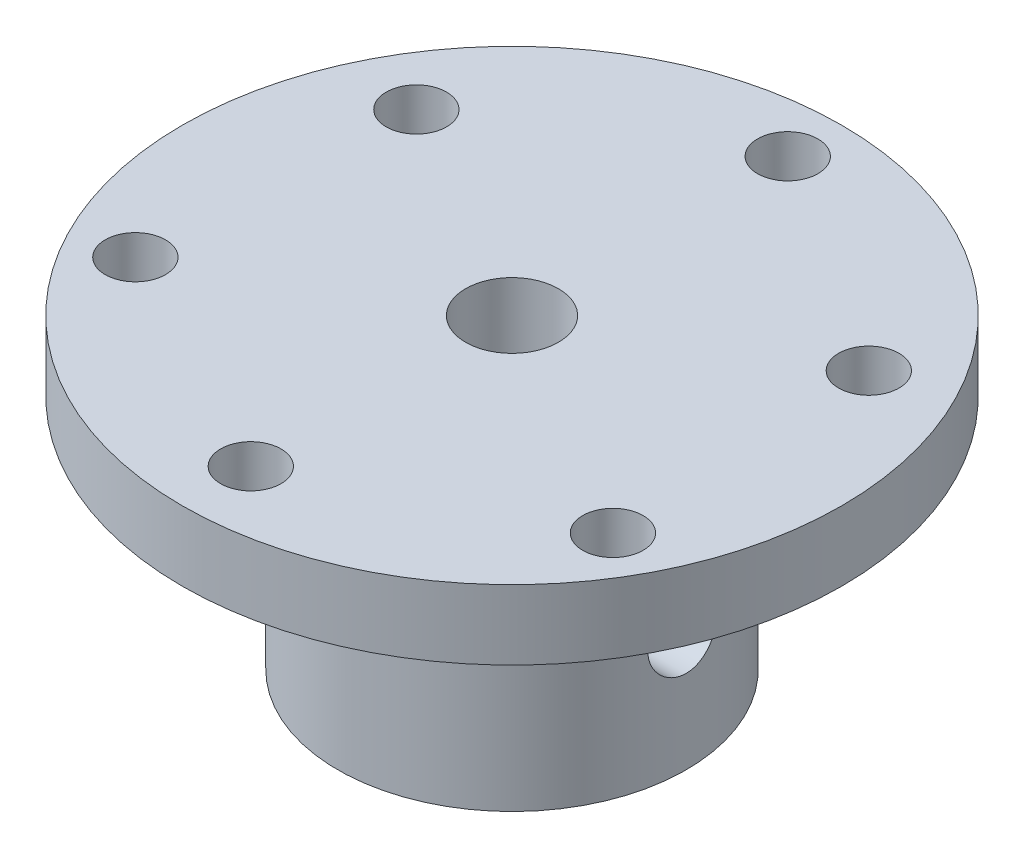
ISO-10303-21;
HEADER;
FILE_DESCRIPTION(('STEP AP214'),'2;1');
FILE_NAME('part.step','',(''),(''),'','','');
FILE_SCHEMA(('AUTOMOTIVE_DESIGN { 1 0 10303 214 1 1 1 1 }'));
ENDSEC;
DATA;
#1=APPLICATION_CONTEXT('core data for automotive mechanical design processes');
#2=APPLICATION_PROTOCOL_DEFINITION('international standard','automotive_design',2000,#1);
#3=PRODUCT_CONTEXT('',#1,'mechanical');
#4=PRODUCT('Part','Part','',(#3));
#5=PRODUCT_RELATED_PRODUCT_CATEGORY('part','',(#4));
#6=PRODUCT_DEFINITION_FORMATION('','',#4);
#7=PRODUCT_DEFINITION_CONTEXT('part definition',#1,'design');
#8=PRODUCT_DEFINITION('design','',#6,#7);
#9=PRODUCT_DEFINITION_SHAPE('','',#8);
#10=(LENGTH_UNIT() NAMED_UNIT(*) SI_UNIT(.MILLI.,.METRE.));
#11=(NAMED_UNIT(*) PLANE_ANGLE_UNIT() SI_UNIT($,.RADIAN.));
#12=(NAMED_UNIT(*) SI_UNIT($,.STERADIAN.) SOLID_ANGLE_UNIT());
#13=UNCERTAINTY_MEASURE_WITH_UNIT(LENGTH_MEASURE(1.E-05),#10,'distance_accuracy_value','');
#14=(GEOMETRIC_REPRESENTATION_CONTEXT(3) GLOBAL_UNCERTAINTY_ASSIGNED_CONTEXT((#13)) GLOBAL_UNIT_ASSIGNED_CONTEXT((#10,
#11,#12)) REPRESENTATION_CONTEXT('',''));
#15=CARTESIAN_POINT('',(0.,0.,0.));
#16=DIRECTION('',(0.,0.,1.));
#17=DIRECTION('',(1.,0.,0.));
#18=AXIS2_PLACEMENT_3D('',#15,#16,#17);
#19=CARTESIAN_POINT('',(1.55257751099924E-13,-54.52159987768,0.));
#20=DIRECTION('',(0.,-1.,0.));
#21=DIRECTION('',(0.,0.,-1.));
#22=AXIS2_PLACEMENT_3D('',#19,#20,#21);
#23=CYLINDRICAL_SURFACE('',#22,14.9999999999998);
#24=CARTESIAN_POINT('',(1.55257751099924E-13,-54.52159987768,0.));
#25=DIRECTION('',(0.,-1.,0.));
#26=DIRECTION('',(0.,0.,-1.));
#27=AXIS2_PLACEMENT_3D('',#24,#25,#26);
#28=CIRCLE('',#27,14.9999999999998);
#29=CARTESIAN_POINT('',(1.55257751099924E-13,-54.5215998776801,-14.9999999999997));
#30=VERTEX_POINT('',#29);
#31=EDGE_CURVE('E144',#30,#30,#28,.F.);
#32=ORIENTED_EDGE('',*,*,#31,.F.);
#33=EDGE_LOOP('',(#32));
#34=FACE_BOUND('',#33,.T.);
#35=CARTESIAN_POINT('',(1.69413094663895E-13,-74.9215998776793,1.03816544499901E-13));
#36=DIRECTION('',(0.,-1.,0.));
#37=DIRECTION('',(0.,0.,-1.));
#38=AXIS2_PLACEMENT_3D('',#35,#36,#37);
#39=CIRCLE('',#38,14.9999999999998);
#40=CARTESIAN_POINT('',(1.69413094663895E-13,-74.9215998776794,-14.9999999999997));
#41=VERTEX_POINT('',#40);
#42=EDGE_CURVE('E142',#41,#41,#39,.T.);
#43=ORIENTED_EDGE('',*,*,#42,.F.);
#44=EDGE_LOOP('',(#43));
#45=FACE_BOUND('',#44,.T.);
#46=CARTESIAN_POINT('',(15.000000000046,-67.7215998777258,1.86558450635894E-07));
#47=CARTESIAN_POINT('',(14.9999963997649,-67.7215926531144,-0.166698082780261));
#48=CARTESIAN_POINT('',(14.9971920634316,-67.7076562578434,-0.333497394223498));
#49=CARTESIAN_POINT('',(14.9862729458645,-67.6523140609351,-0.66240731465942));
#50=CARTESIAN_POINT('',(14.9781527483654,-67.6108802419201,-0.824512965239969));
#51=CARTESIAN_POINT('',(14.9575090504927,-67.5018739375577,-1.13919594294946));
#52=CARTESIAN_POINT('',(14.9449900940408,-67.4343284184306,-1.29178291207616));
#53=CARTESIAN_POINT('',(14.9169107519296,-67.275095994099,-1.58343496808504));
#54=CARTESIAN_POINT('',(14.9013507849818,-67.1834124118199,-1.72250191257295));
#55=CARTESIAN_POINT('',(14.8686667382793,-66.977195976749,-1.98506599350946));
#56=CARTESIAN_POINT('',(14.8515260538317,-66.8624008168566,-2.10835505860162));
#57=CARTESIAN_POINT('',(14.8177290367574,-66.6137504147554,-2.33408823211654));
#58=CARTESIAN_POINT('',(14.8010728472905,-66.4798896065078,-2.43652623197564));
#59=CARTESIAN_POINT('',(14.7699650278113,-66.1953810678387,-2.61854253664776));
#60=CARTESIAN_POINT('',(14.7555358847798,-66.0445857141428,-2.69789403137976));
#61=CARTESIAN_POINT('',(14.7307774047371,-65.731567454451,-2.82997431798646));
#62=CARTESIAN_POINT('',(14.7204433956697,-65.5693578211325,-2.88273346733814));
#63=CARTESIAN_POINT('',(14.7075849571317,-65.2921803253139,-2.94747629125724));
#64=CARTESIAN_POINT('',(14.7036135358617,-65.1790141209352,-2.96714173280928));
#65=CARTESIAN_POINT('',(14.6982889766829,-64.9511145376317,-2.99340595024478));
#66=CARTESIAN_POINT('',(14.6969357829237,-64.8363811921887,-3.00000500485279));
#67=CARTESIAN_POINT('',(14.6969423389802,-64.5549391637626,-2.99999273302925));
#68=CARTESIAN_POINT('',(14.6998047420136,-64.3881773186012,-2.98606239427077));
#69=CARTESIAN_POINT('',(14.7109309307274,-64.0593452957412,-2.9307464687347));
#70=CARTESIAN_POINT('',(14.7192002536061,-63.8972801057403,-2.88933273570629));
#71=CARTESIAN_POINT('',(14.7401666614007,-63.5826827727158,-2.7803851595184));
#72=CARTESIAN_POINT('',(14.7528590148767,-63.4301406473939,-2.71287921953472));
#73=CARTESIAN_POINT('',(14.7812351990608,-63.1385641919615,-2.55374009232498));
#74=CARTESIAN_POINT('',(14.796918629339,-62.9995280574947,-2.4621101340744));
#75=CARTESIAN_POINT('',(14.8297572223006,-62.7369311659323,-2.2559486811057));
#76=CARTESIAN_POINT('',(14.846928456545,-62.6135877829732,-2.1411428368226));
#77=CARTESIAN_POINT('',(14.880670586106,-62.3877492033761,-1.89244801278831));
#78=CARTESIAN_POINT('',(14.8972413092134,-62.285259948817,-1.75855361246264));
#79=CARTESIAN_POINT('',(14.9280920406553,-62.103188525339,-1.47401378204806));
#80=CARTESIAN_POINT('',(14.942349741359,-62.0238241571099,-1.32322650921909));
#81=CARTESIAN_POINT('',(14.9667626039625,-61.8917177617623,-1.01022564534638));
#82=CARTESIAN_POINT('',(14.9769224131987,-61.8389455599645,-0.848025244376736));
#83=CARTESIAN_POINT('',(14.9895544323202,-61.7741666828073,-0.570813239900573));
#84=CARTESIAN_POINT('',(14.9934520300269,-61.754484989569,-0.457600269282014));
#85=CARTESIAN_POINT('',(14.9986760294316,-61.7281992231121,-0.229607461689999));
#86=CARTESIAN_POINT('',(15.0000024821496,-61.7215948903949,-0.114827655853301));
#87=CARTESIAN_POINT('',(14.9999963966024,-61.7216071178449,0.166698363387014));
#88=CARTESIAN_POINT('',(14.9971920571715,-61.7355435287599,0.333497674176672));
#89=CARTESIAN_POINT('',(14.9862729336636,-61.7908857567333,0.662407590507356));
#90=CARTESIAN_POINT('',(14.978152733326,-61.8323195911459,0.82451323763765));
#91=CARTESIAN_POINT('',(14.9575090304125,-61.9413259255302,1.13919620593118));
#92=CARTESIAN_POINT('',(14.9449900717565,-62.0088714592891,1.29178316909247));
#93=CARTESIAN_POINT('',(14.9169107260914,-62.1681039117776,1.58343521086756));
#94=CARTESIAN_POINT('',(14.9013507577931,-62.2597875075859,1.72250214708523));
#95=CARTESIAN_POINT('',(14.8686667093752,-62.466003968548,1.98506620939616));
#96=CARTESIAN_POINT('',(14.8515260245734,-62.5807991408072,2.10835526408974));
#97=CARTESIAN_POINT('',(14.8177290078867,-62.8294495659386,2.33408841484878));
#98=CARTESIAN_POINT('',(14.801072819162,-62.9633103848511,2.43652640234752));
#99=CARTESIAN_POINT('',(14.7699650023201,-63.2478189421013,2.61854267993907));
#100=CARTESIAN_POINT('',(14.755535861181,-63.3986143036091,2.69789416006413));
#101=CARTESIAN_POINT('',(14.7307773857894,-63.7116325762633,2.82997441625065));
#102=CARTESIAN_POINT('',(14.7204433794757,-63.8738422147243,2.88273354981557));
#103=CARTESIAN_POINT('',(14.7075849481815,-64.1510196694478,2.94747633571416));
#104=CARTESIAN_POINT('',(14.7036135302357,-64.2641858271393,2.96714176063788));
#105=CARTESIAN_POINT('',(14.6982889755318,-64.4920853150782,2.99340595584585));
#106=CARTESIAN_POINT('',(14.6969357829235,-64.6068186118439,3.00000500485377));
#107=CARTESIAN_POINT('',(14.696942338982,-64.8882605914658,2.9999927330259));
#108=CARTESIAN_POINT('',(14.6998047420114,-65.0550224365915,2.98606239428305));
#109=CARTESIAN_POINT('',(14.7109309307193,-65.3838544594857,2.93074646877393));
#110=CARTESIAN_POINT('',(14.7192002536012,-65.5459196495521,2.8893327357318));
#111=CARTESIAN_POINT('',(14.740166661402,-65.8605169826586,2.78038515951226));
#112=CARTESIAN_POINT('',(14.7528590148796,-66.0130591080001,2.71287921951962));
#113=CARTESIAN_POINT('',(14.7812351990644,-66.3046355634316,2.55374009230438));
#114=CARTESIAN_POINT('',(14.7969186293409,-66.4436716978808,2.46211013406274));
#115=CARTESIAN_POINT('',(14.8297572222987,-66.7062685894129,2.25594868111772));
#116=CARTESIAN_POINT('',(14.8469284565411,-66.8296119723593,2.14114283684938));
#117=CARTESIAN_POINT('',(14.8806705861024,-67.0554505519616,1.89244801281728));
#118=CARTESIAN_POINT('',(14.8972413092121,-67.1579398065342,1.75855361247482));
#119=CARTESIAN_POINT('',(14.9280920406619,-67.3400112300612,1.47401378198792));
#120=CARTESIAN_POINT('',(14.9423497413702,-67.4193755983178,1.32322650909819));
#121=CARTESIAN_POINT('',(14.9667626039733,-67.5514819936492,1.010225645186));
#122=CARTESIAN_POINT('',(14.976922413208,-67.6042541954271,0.848025244248066));
#123=CARTESIAN_POINT('',(14.9895544302506,-67.6690330619504,0.570813285267943));
#124=CARTESIAN_POINT('',(14.9934520268511,-67.6887147497874,0.457600361280983));
#125=CARTESIAN_POINT('',(14.9986760262397,-67.7150005162109,0.229607647598138));
#126=CARTESIAN_POINT('',(15.0000024800477,-67.7216048542953,0.114827889038953));
#127=CARTESIAN_POINT('',(15.000000000046,-67.7215998777258,1.86558450635894E-07));
#128=B_SPLINE_CURVE_WITH_KNOTS('',3,(#46,#47,#48,#49,#50,#51,#52,#53,#54,#55,#56,#57,#58,#59,
#60,#61,#62,#63,#64,#65,#66,#67,#68,#69,#70,#71,#72,#73,#74,#75,#76,#77,#78,#79,#80,#81,#82,#83,
#84,#85,#86,#87,#88,#89,#90,#91,#92,#93,#94,#95,#96,#97,#98,#99,#100,#101,#102,#103,#104,#105,
#106,#107,#108,#109,#110,#111,#112,#113,#114,#115,#116,#117,#118,#119,#120,#121,#122,#123,#124,
#125,#126,#127),.UNSPECIFIED.,.T.,.F.,(4,2,2,2,2,2,2,2,2,2,2,2,2,2,2,2,2,2,2,2,2,2,2,2,2,2,2,2,
2,2,2,2,2,2,2,2,2,2,2,2,4),(0.,0.499672023475098,0.999853950636071,1.49952070115674,
1.99911870184079,2.50474378353039,3.01051678148261,3.52110273620196,4.03110448490524,
4.37516445508649,4.71921708590204,5.21877624604919,5.7188478050919,6.21838605740392,
6.71785748098797,7.22363042822151,7.7295472868699,8.24008553097335,8.75004314486042,
9.09424199304405,9.43843401110368,9.9381060367828,10.4382879657267,10.9379547181531,
11.4375527208228,11.9431778050308,12.4489508055626,12.9595367601418,13.4695385082209,
13.8135983326046,14.1576508176423,14.6572099775613,15.1572815368321,15.6568197892009,
16.1562912127282,16.6620641599056,17.1679810186101,17.6785192629423,18.1884768766006,
18.5326755851104,18.8768674635086),.UNSPECIFIED.);
#129=CARTESIAN_POINT('',(15.000000000046,-67.7215998777258,1.86558450635894E-07));
#130=VERTEX_POINT('',#129);
#131=EDGE_CURVE('E18',#130,#130,#128,.T.);
#132=ORIENTED_EDGE('',*,*,#131,.F.);
#133=EDGE_LOOP('',(#132));
#134=FACE_BOUND('',#133,.T.);
#135=ADVANCED_FACE('F14',(#34,#45,#134),#23,.T.);
#136=CARTESIAN_POINT('',(2.57135223940552,-64.72159987768,1.18828558104411E-13));
#137=DIRECTION('',(1.,0.,0.));
#138=DIRECTION('',(0.,0.,-1.));
#139=AXIS2_PLACEMENT_3D('',#136,#137,#138);
#140=CYLINDRICAL_SURFACE('',#139,2.99999999999982);
#141=CARTESIAN_POINT('',(4.,-67.7215998776798,-7.713188046811E-08));
#142=CARTESIAN_POINT('',(3.99999929499828,-67.7215991300168,-0.0732533381060693));
#143=CARTESIAN_POINT('',(3.99798092955644,-67.7189098049245,-0.146529893947093));
#144=CARTESIAN_POINT('',(3.98996394337481,-67.7082070027959,-0.292488020927439));
#145=CARTESIAN_POINT('',(3.9839628006922,-67.7001901523017,-0.365169185518362));
#146=CARTESIAN_POINT('',(3.96013044812875,-67.6682680006064,-0.581712926868116));
#147=CARTESIAN_POINT('',(3.93647079808005,-67.6364915273741,-0.723883851682026));
#148=CARTESIAN_POINT('',(3.87591420077757,-67.554173713555,-0.998509938548491));
#149=CARTESIAN_POINT('',(3.83909831236029,-67.5037472152894,-1.13101874051589));
#150=CARTESIAN_POINT('',(3.75500800299701,-67.3865114459472,-1.38484080979174));
#151=CARTESIAN_POINT('',(3.70773711468801,-67.319707707747,-1.50615783911038));
#152=CARTESIAN_POINT('',(3.60099398693729,-67.1650767599583,-1.74693119157333));
#153=CARTESIAN_POINT('',(3.54079717040991,-67.0758754310035,-1.86517446528771));
#154=CARTESIAN_POINT('',(3.41533129694746,-66.8826009883685,-2.08606290410851));
#155=CARTESIAN_POINT('',(3.35005440215703,-66.7785046776763,-2.18868321410206));
#156=CARTESIAN_POINT('',(3.24492577661598,-66.6010703175485,-2.33992737314269));
#157=CARTESIAN_POINT('',(3.20529602946461,-66.5319818680656,-2.39378522149209));
#158=CARTESIAN_POINT('',(3.12678229847829,-66.3890355871553,-2.49546666890116));
#159=CARTESIAN_POINT('',(3.08789854720533,-66.3151762987904,-2.54328841133458));
#160=CARTESIAN_POINT('',(3.01212069913845,-66.1628603235472,-2.63259462430775));
#161=CARTESIAN_POINT('',(2.9752245882699,-66.0844084652277,-2.6740855910491));
#162=CARTESIAN_POINT('',(2.9047984813979,-65.9229034756795,-2.75042624886456));
#163=CARTESIAN_POINT('',(2.87126785556814,-65.8398512099157,-2.78527718367354));
#164=CARTESIAN_POINT('',(2.79914098665088,-65.6415358073907,-2.85800766987475));
#165=CARTESIAN_POINT('',(2.76242904532995,-65.5245621753583,-2.89320335006847));
#166=CARTESIAN_POINT('',(2.70242410844761,-65.2841489011275,-2.94934571942014));
#167=CARTESIAN_POINT('',(2.67908223001882,-65.1607346370112,-2.9703443664381));
#168=CARTESIAN_POINT('',(2.65819455331086,-64.98368779207,-2.9889888465219));
#169=CARTESIAN_POINT('',(2.65354649152577,-64.9314816001799,-2.99310959767992));
#170=CARTESIAN_POINT('',(2.6473238013952,-64.8267195172946,-2.99861587495348));
#171=CARTESIAN_POINT('',(2.64575002516424,-64.774163533395,-3.00000064272455));
#172=CARTESIAN_POINT('',(2.64575302305437,-64.6516190088533,-2.99999914430497));
#173=CARTESIAN_POINT('',(2.64854654097793,-64.581624541693,-2.99754264120041));
#174=CARTESIAN_POINT('',(2.65953431453366,-64.4423826877346,-2.98779591613633));
#175=CARTESIAN_POINT('',(2.66773231078028,-64.37313585216,-2.9805023462653));
#176=CARTESIAN_POINT('',(2.69982299492562,-64.1671900048354,-2.95157928345912));
#177=CARTESIAN_POINT('',(2.73120940265821,-64.0325745842951,-2.92290857472894));
#178=CARTESIAN_POINT('',(2.80749605677538,-63.7743928242619,-2.84967699831342));
#179=CARTESIAN_POINT('',(2.85219956018265,-63.6506974768152,-2.80534583309274));
#180=CARTESIAN_POINT('',(2.94973835359,-63.41290492396,-2.70260446077104));
#181=CARTESIAN_POINT('',(3.00257167319304,-63.2988054031778,-2.64419766319837));
#182=CARTESIAN_POINT('',(3.12354454469854,-63.0573719963837,-2.50080117757686));
#183=CARTESIAN_POINT('',(3.19257158813369,-62.9322748678763,-2.41280577144758));
#184=CARTESIAN_POINT('',(3.33043529129361,-62.6965286510288,-2.21864986474646));
#185=CARTESIAN_POINT('',(3.39927153241035,-62.5859006775038,-2.112463328145));
#186=CARTESIAN_POINT('',(3.50538883835854,-62.4216104760991,-1.92838030024727));
#187=CARTESIAN_POINT('',(3.54434235955007,-62.3627764804566,-1.85600252515769));
#188=CARTESIAN_POINT('',(3.61934915029765,-62.2515024798977,-1.70511021653619));
#189=CARTESIAN_POINT('',(3.65540376129551,-62.1990595117357,-1.62659855494925));
#190=CARTESIAN_POINT('',(3.72358398932162,-62.1012363708587,-1.46379620817689));
#191=CARTESIAN_POINT('',(3.75571388240212,-62.0558484965221,-1.37951197149203));
#192=CARTESIAN_POINT('',(3.81508806788733,-61.9728298421002,-1.205629770678));
#193=CARTESIAN_POINT('',(3.84233514561251,-61.9351946377903,-1.11603487499359));
#194=CARTESIAN_POINT('',(3.90067744767782,-61.8551888590705,-0.895719301211897));
#195=CARTESIAN_POINT('',(3.92902524081272,-61.8168427869583,-0.76276023584026));
#196=CARTESIAN_POINT('',(3.97212418340322,-61.7588053333238,-0.490969514686286));
#197=CARTESIAN_POINT('',(3.98691603312664,-61.7390581057822,-0.352156755533455));
#198=CARTESIAN_POINT('',(3.9962342780314,-61.7266227594058,-0.177136193474058));
#199=CARTESIAN_POINT('',(3.99764470359634,-61.7247409886809,-0.141757178173945));
#200=CARTESIAN_POINT('',(3.99952780704901,-61.7222292709695,-0.0709205923061069));
#201=CARTESIAN_POINT('',(4.00000034089215,-61.7215995162717,-0.0354630105089156));
#202=CARTESIAN_POINT('',(3.99999929584547,-61.7216006242136,0.0732532913577006));
#203=CARTESIAN_POINT('',(3.99798093127785,-61.7242899481403,0.146529846779353));
#204=CARTESIAN_POINT('',(3.98996394687658,-61.7349927478868,0.292487973059437));
#205=CARTESIAN_POINT('',(3.98396280509998,-61.7430095971647,0.365169137369532));
#206=CARTESIAN_POINT('',(3.96013045527013,-61.774931745164,0.581712878099376));
#207=CARTESIAN_POINT('',(3.93647080706236,-61.8067082158726,0.723883802786301));
#208=CARTESIAN_POINT('',(3.87591421329461,-61.8890260246947,0.998509889928491));
#209=CARTESIAN_POINT('',(3.83909832656892,-61.9394525204913,1.1310186922936));
#210=CARTESIAN_POINT('',(3.75500802035143,-62.056688284988,1.38484076274157));
#211=CARTESIAN_POINT('',(3.70773713349663,-62.1234920208119,1.50615779283441));
#212=CARTESIAN_POINT('',(3.6009940087606,-62.2781229632996,1.74693114655928));
#213=CARTESIAN_POINT('',(3.54079719381056,-62.3673242892504,1.86517442086581));
#214=CARTESIAN_POINT('',(3.41533132310343,-62.5605987257518,2.08606286128666));
#215=CARTESIAN_POINT('',(3.35005442949122,-62.6646950333115,2.18868317229164));
#216=CARTESIAN_POINT('',(3.2449258052845,-62.8421293883701,2.33992733339844));
#217=CARTESIAN_POINT('',(3.20529605848703,-62.9112178359806,2.39378518264846));
#218=CARTESIAN_POINT('',(3.12678232792135,-63.0541641130701,2.49546663202645));
#219=CARTESIAN_POINT('',(3.08789857671505,-63.1280233994864,2.54328837552837));
#220=CARTESIAN_POINT('',(3.01212072839489,-63.280339370776,2.63259459085571));
#221=CARTESIAN_POINT('',(2.97522461720751,-63.3587912270921,2.67408555888025));
#222=CARTESIAN_POINT('',(2.90479850921788,-63.520296212564,2.75042621951014));
#223=CARTESIAN_POINT('',(2.87126788258964,-63.6033484762552,2.78527715584985));
#224=CARTESIAN_POINT('',(2.79914101008067,-63.8016638767747,2.85800764701015));
#225=CARTESIAN_POINT('',(2.76242906595888,-63.9186375090654,2.89320333043501));
#226=CARTESIAN_POINT('',(2.70242412299003,-64.1590507844108,2.94934570615633));
#227=CARTESIAN_POINT('',(2.67908224127978,-64.2824650493825,2.97034435631058));
#228=CARTESIAN_POINT('',(2.65819455868807,-64.459511906624,2.98898884174938));
#229=CARTESIAN_POINT('',(2.65354649489957,-64.511718109716,2.99310959469143));
#230=CARTESIAN_POINT('',(2.64732380208032,-64.6164802152241,2.99861587435145));
#231=CARTESIAN_POINT('',(2.64575002516441,-64.6690362105447,3.00000064272468));
#232=CARTESIAN_POINT('',(2.64575302305368,-64.7915807465231,2.99999914430554));
#233=CARTESIAN_POINT('',(2.64854654097865,-64.8615752136919,2.99754264119991));
#234=CARTESIAN_POINT('',(2.65953431453799,-65.0008170676654,2.98779591613275));
#235=CARTESIAN_POINT('',(2.66773231078632,-65.0700639032466,2.98050234626013));
#236=CARTESIAN_POINT('',(2.69982299493338,-65.2760097505596,2.95157928345217));
#237=CARTESIAN_POINT('',(2.73120940266283,-65.410625171081,2.92290857472467));
#238=CARTESIAN_POINT('',(2.80749605677378,-65.6688069310926,2.84967699831518));
#239=CARTESIAN_POINT('',(2.85219956017938,-65.7925022785358,2.8053458330962));
#240=CARTESIAN_POINT('',(2.9497383535861,-66.0302948313917,2.70260446077553));
#241=CARTESIAN_POINT('',(3.00257167319071,-66.1443943521776,2.6441976632013));
#242=CARTESIAN_POINT('',(3.12354454469797,-66.3858277589753,2.50080117757778));
#243=CARTESIAN_POINT('',(3.19257158813321,-66.5109248874829,2.41280577144842));
#244=CARTESIAN_POINT('',(3.33043529129306,-66.7466711043303,2.21864986474748));
#245=CARTESIAN_POINT('',(3.39927153240963,-66.8572990778551,2.11246332814633));
#246=CARTESIAN_POINT('',(3.50538883835873,-67.0215892792613,1.92838030024721));
#247=CARTESIAN_POINT('',(3.54434235955126,-67.0804232749053,1.85600252515572));
#248=CARTESIAN_POINT('',(3.61934915030067,-67.1916972754668,1.70511021653009));
#249=CARTESIAN_POINT('',(3.65540376129936,-67.2441402436299,1.62659855494093));
#250=CARTESIAN_POINT('',(3.7235839893251,-67.3419633845063,1.4637962081681));
#251=CARTESIAN_POINT('',(3.7557138824046,-67.3873512588414,1.3795119714853));
#252=CARTESIAN_POINT('',(3.81508806788807,-67.4703699132608,1.20562977067572));
#253=CARTESIAN_POINT('',(3.84233514561249,-67.5080051175697,1.11603487499369));
#254=CARTESIAN_POINT('',(3.90067744761298,-67.5880108962006,0.895719301457203));
#255=CARTESIAN_POINT('',(3.92902524070515,-67.6263569682561,0.762760236345317));
#256=CARTESIAN_POINT('',(3.97212418326752,-67.6843944218543,0.490969515714705));
#257=CARTESIAN_POINT('',(3.98691603300323,-67.7041416494133,0.352156756824409));
#258=CARTESIAN_POINT('',(3.99623427838624,-67.7165769964277,0.177136187071141));
#259=CARTESIAN_POINT('',(3.99764470417652,-67.718458767453,0.14175716380889));
#260=CARTESIAN_POINT('',(3.99952780765691,-67.7209704852012,0.0709205619968657));
#261=CARTESIAN_POINT('',(4.00000034130236,-67.7216002396352,0.0354629722176238));
#262=CARTESIAN_POINT('',(4.,-67.7215998776798,-7.713188046811E-08));
#263=B_SPLINE_CURVE_WITH_KNOTS('',3,(#141,#142,#143,#144,#145,#146,#147,#148,#149,#150,#151,
#152,#153,#154,#155,#156,#157,#158,#159,#160,#161,#162,#163,#164,#165,#166,#167,#168,#169,#170,
#171,#172,#173,#174,#175,#176,#177,#178,#179,#180,#181,#182,#183,#184,#185,#186,#187,#188,#189,
#190,#191,#192,#193,#194,#195,#196,#197,#198,#199,#200,#201,#202,#203,#204,#205,#206,#207,#208,
#209,#210,#211,#212,#213,#214,#215,#216,#217,#218,#219,#220,#221,#222,#223,#224,#225,#226,#227,
#228,#229,#230,#231,#232,#233,#234,#235,#236,#237,#238,#239,#240,#241,#242,#243,#244,#245,#246,
#247,#248,#249,#250,#251,#252,#253,#254,#255,#256,#257,#258,#259,#260,#261,#262),.UNSPECIFIED.,
.T.,.F.,(4,2,2,2,2,2,2,2,2,2,2,2,2,2,2,2,2,2,2,2,2,2,2,2,2,2,2,2,2,2,2,2,2,2,2,2,2,2,2,2,2,2,2,
2,2,2,2,2,2,2,2,2,2,2,2,2,2,2,2,2,4),(0.,0.219715618632366,0.439570496768696,0.879847564029078,
1.31745746550359,1.75491972837329,2.23289969222148,2.71163231812238,2.99980991865071,
3.2880759438997,3.57604415200134,3.86395836804828,4.24525436596006,4.62514724346852,
4.78273546133884,4.94036735249909,5.15023130788716,5.36024066962952,5.78111015961033,
6.19604661973787,6.61088267100983,7.11264487687529,7.61513132244989,7.91800593981203,
8.2207395885486,8.52314040445882,8.82536816794349,9.24725288834724,9.66786675520902,
9.77421816619149,9.88058590972117,10.100301526896,10.3201564035819,10.7604334679724,
11.1980433666935,11.6355056268141,12.1134855851845,12.5922182055129,12.8803958030906,
13.1686618253811,13.456630030632,13.7445442438485,14.1258402475953,14.5057331309859,
14.6633213830826,14.8209533084763,15.0308172639011,15.2408266256614,15.6616961155874,
16.0766325757019,16.4914686269867,16.9932308328528,17.4957172784262,17.7985918957961,
18.1013255445405,18.4037263604426,18.7059541239197,19.1278388435236,19.5484527096549,
19.6548041445282,19.761171911953),.UNSPECIFIED.);
#264=CARTESIAN_POINT('',(4.,-67.7215998776798,-7.713188046811E-08));
#265=VERTEX_POINT('',#264);
#266=EDGE_CURVE('E72',#265,#265,#263,.T.);
#267=ORIENTED_EDGE('',*,*,#266,.F.);
#268=EDGE_LOOP('',(#267));
#269=FACE_BOUND('',#268,.T.);
#270=ORIENTED_EDGE('',*,*,#131,.T.);
#271=EDGE_LOOP('',(#270));
#272=FACE_BOUND('',#271,.T.);
#273=ADVANCED_FACE('F84',(#269,#272),#140,.F.);
#274=CARTESIAN_POINT('',(-15.6,-74.92159987768,-15.61563010652));
#275=DIRECTION('',(0.,-1.,0.));
#276=DIRECTION('',(1.,0.,0.));
#277=AXIS2_PLACEMENT_3D('',#274,#275,#276);
#278=PLANE('',#277);
#279=CARTESIAN_POINT('',(1.52655665885959E-13,-74.9215998776791,1.09939835013408E-13));
#280=DIRECTION('',(0.,-1.,0.));
#281=DIRECTION('',(0.,0.,-1.));
#282=AXIS2_PLACEMENT_3D('',#279,#280,#281);
#283=CIRCLE('',#282,3.99999999999985);
#284=CARTESIAN_POINT('',(1.52655665885959E-13,-74.9215998776791,-3.99999999999974));
#285=VERTEX_POINT('',#284);
#286=EDGE_CURVE('E69',#285,#285,#283,.T.);
#287=ORIENTED_EDGE('',*,*,#286,.F.);
#288=EDGE_LOOP('',(#287));
#289=FACE_BOUND('',#288,.T.);
#290=ORIENTED_EDGE('',*,*,#42,.T.);
#291=EDGE_LOOP('',(#290));
#292=FACE_BOUND('',#291,.T.);
#293=ADVANCED_FACE('F87',(#289,#292),#278,.T.);
#294=CARTESIAN_POINT('',(-29.536,-54.52159987768,-29.536));
#295=DIRECTION('',(0.,-1.,0.));
#296=DIRECTION('',(1.,0.,0.));
#297=AXIS2_PLACEMENT_3D('',#294,#295,#296);
#298=PLANE('',#297);
#299=CARTESIAN_POINT('',(20.56810333988,-54.5215998776798,11.875));
#300=DIRECTION('',(0.,-1.,0.));
#301=DIRECTION('',(0.,0.,-1.));
#302=AXIS2_PLACEMENT_3D('',#299,#300,#301);
#303=CIRCLE('',#302,2.6);
#304=CARTESIAN_POINT('',(20.56810333988,-54.5215998776798,9.27500000000001));
#305=VERTEX_POINT('',#304);
#306=EDGE_CURVE('E51',#305,#305,#303,.T.);
#307=ORIENTED_EDGE('',*,*,#306,.F.);
#308=EDGE_LOOP('',(#307));
#309=FACE_BOUND('',#308,.T.);
#310=CARTESIAN_POINT('',(3.80771802976909E-13,-54.5215998776798,-23.75));
#311=DIRECTION('',(0.,-1.,0.));
#312=DIRECTION('',(0.,0.,-1.));
#313=AXIS2_PLACEMENT_3D('',#310,#311,#312);
#314=CIRCLE('',#313,2.59999999999962);
#315=CARTESIAN_POINT('',(3.80771802976909E-13,-54.5215998776798,-26.3499999999996));
#316=VERTEX_POINT('',#315);
#317=EDGE_CURVE('E54',#316,#316,#314,.T.);
#318=ORIENTED_EDGE('',*,*,#317,.F.);
#319=EDGE_LOOP('',(#318));
#320=FACE_BOUND('',#319,.T.);
#321=CARTESIAN_POINT('',(-20.56810333988,-54.5215998776798,11.875));
#322=DIRECTION('',(0.,-1.,0.));
#323=DIRECTION('',(0.,0.,-1.));
#324=AXIS2_PLACEMENT_3D('',#321,#322,#323);
#325=CIRCLE('',#324,2.59999999999999);
#326=CARTESIAN_POINT('',(-20.56810333988,-54.5215998776798,9.27500000000002));
#327=VERTEX_POINT('',#326);
#328=EDGE_CURVE('E57',#327,#327,#325,.T.);
#329=ORIENTED_EDGE('',*,*,#328,.F.);
#330=EDGE_LOOP('',(#329));
#331=FACE_BOUND('',#330,.T.);
#332=CARTESIAN_POINT('',(19.48557158515,-54.5215998776798,-11.25));
#333=DIRECTION('',(0.,-1.,0.));
#334=DIRECTION('',(0.,0.,-1.));
#335=AXIS2_PLACEMENT_3D('',#332,#333,#334);
#336=CIRCLE('',#335,2.6);
#337=CARTESIAN_POINT('',(19.48557158515,-54.5215998776798,-13.85));
#338=VERTEX_POINT('',#337);
#339=EDGE_CURVE('E60',#338,#338,#336,.T.);
#340=ORIENTED_EDGE('',*,*,#339,.F.);
#341=EDGE_LOOP('',(#340));
#342=FACE_BOUND('',#341,.T.);
#343=CARTESIAN_POINT('',(-19.48557158515,-54.5215998776798,-11.25));
#344=DIRECTION('',(0.,-1.,0.));
#345=DIRECTION('',(0.,0.,-1.));
#346=AXIS2_PLACEMENT_3D('',#343,#344,#345);
#347=CIRCLE('',#346,2.6);
#348=CARTESIAN_POINT('',(-19.48557158515,-54.5215998776798,-13.85));
#349=VERTEX_POINT('',#348);
#350=EDGE_CURVE('E63',#349,#349,#347,.T.);
#351=ORIENTED_EDGE('',*,*,#350,.F.);
#352=EDGE_LOOP('',(#351));
#353=FACE_BOUND('',#352,.T.);
#354=CARTESIAN_POINT('',(0.,-54.5215998776798,22.5));
#355=DIRECTION('',(0.,-1.,0.));
#356=DIRECTION('',(0.,0.,-1.));
#357=AXIS2_PLACEMENT_3D('',#354,#355,#356);
#358=CIRCLE('',#357,2.60000000000006);
#359=CARTESIAN_POINT('',(0.,-54.5215998776798,19.8999999999999));
#360=VERTEX_POINT('',#359);
#361=EDGE_CURVE('E66',#360,#360,#358,.T.);
#362=ORIENTED_EDGE('',*,*,#361,.F.);
#363=EDGE_LOOP('',(#362));
#364=FACE_BOUND('',#363,.T.);
#365=ORIENTED_EDGE('',*,*,#31,.T.);
#366=EDGE_LOOP('',(#365));
#367=FACE_BOUND('',#366,.T.);
#368=CARTESIAN_POINT('',(1.56589334613174E-13,-54.5215998776798,0.));
#369=DIRECTION('',(0.,-1.,0.));
#370=DIRECTION('',(0.,0.,-1.));
#371=AXIS2_PLACEMENT_3D('',#368,#369,#370);
#372=CIRCLE('',#371,28.3999999999998);
#373=CARTESIAN_POINT('',(1.56589334613174E-13,-54.5215998776798,-28.3999999999998));
#374=VERTEX_POINT('',#373);
#375=EDGE_CURVE('E78',#374,#374,#372,.T.);
#376=ORIENTED_EDGE('',*,*,#375,.T.);
#377=EDGE_LOOP('',(#376));
#378=FACE_BOUND('',#377,.T.);
#379=ADVANCED_FACE('F96',(#309,#320,#331,#342,#353,#364,#367,#378),#298,.T.);
#380=CARTESIAN_POINT('',(1.54390389361936E-13,-48.52159987768,0.));
#381=DIRECTION('',(0.,-1.,0.));
#382=DIRECTION('',(0.,0.,-1.));
#383=AXIS2_PLACEMENT_3D('',#380,#381,#382);
#384=CYLINDRICAL_SURFACE('',#383,28.3999999999998);
#385=ORIENTED_EDGE('',*,*,#375,.F.);
#386=EDGE_LOOP('',(#385));
#387=FACE_BOUND('',#386,.T.);
#388=CARTESIAN_POINT('',(1.54390389361936E-13,-48.52159987768,0.));
#389=DIRECTION('',(0.,-1.,0.));
#390=DIRECTION('',(0.,0.,-1.));
#391=AXIS2_PLACEMENT_3D('',#388,#389,#390);
#392=CIRCLE('',#391,28.3999999999998);
#393=CARTESIAN_POINT('',(1.54390389361936E-13,-48.52159987768,-28.3999999999998));
#394=VERTEX_POINT('',#393);
#395=EDGE_CURVE('E48',#394,#394,#392,.T.);
#396=ORIENTED_EDGE('',*,*,#395,.T.);
#397=EDGE_LOOP('',(#396));
#398=FACE_BOUND('',#397,.T.);
#399=ADVANCED_FACE('F89',(#387,#398),#384,.T.);
#400=CARTESIAN_POINT('',(1.52655665885959E-13,-48.52159987768,0.));
#401=DIRECTION('',(0.,-1.,0.));
#402=DIRECTION('',(0.,0.,-1.));
#403=AXIS2_PLACEMENT_3D('',#400,#401,#402);
#404=CYLINDRICAL_SURFACE('',#403,3.99999999999985);
#405=CARTESIAN_POINT('',(1.52655665885959E-13,-48.52159987768,0.));
#406=DIRECTION('',(0.,-1.,0.));
#407=DIRECTION('',(0.,0.,-1.));
#408=AXIS2_PLACEMENT_3D('',#405,#406,#407);
#409=CIRCLE('',#408,3.99999999999985);
#410=CARTESIAN_POINT('',(1.52655665885959E-13,-48.52159987768,-3.99999999999976));
#411=VERTEX_POINT('',#410);
#412=EDGE_CURVE('E45',#411,#411,#409,.F.);
#413=ORIENTED_EDGE('',*,*,#412,.T.);
#414=EDGE_LOOP('',(#413));
#415=FACE_BOUND('',#414,.T.);
#416=ORIENTED_EDGE('',*,*,#286,.T.);
#417=EDGE_LOOP('',(#416));
#418=FACE_BOUND('',#417,.T.);
#419=ORIENTED_EDGE('',*,*,#266,.T.);
#420=EDGE_LOOP('',(#419));
#421=FACE_BOUND('',#420,.T.);
#422=ADVANCED_FACE('F80',(#415,#418,#421),#404,.F.);
#423=CARTESIAN_POINT('',(0.,-48.52159987768,22.5));
#424=DIRECTION('',(0.,-1.,0.));
#425=DIRECTION('',(0.,0.,-1.));
#426=AXIS2_PLACEMENT_3D('',#423,#424,#425);
#427=CYLINDRICAL_SURFACE('',#426,2.60000000000006);
#428=ORIENTED_EDGE('',*,*,#361,.T.);
#429=EDGE_LOOP('',(#428));
#430=FACE_BOUND('',#429,.T.);
#431=CARTESIAN_POINT('',(0.,-48.52159987768,22.5));
#432=DIRECTION('',(0.,-1.,0.));
#433=DIRECTION('',(0.,0.,-1.));
#434=AXIS2_PLACEMENT_3D('',#431,#432,#433);
#435=CIRCLE('',#434,2.60000000000006);
#436=CARTESIAN_POINT('',(0.,-48.52159987768,19.8999999999999));
#437=VERTEX_POINT('',#436);
#438=EDGE_CURVE('E42',#437,#437,#435,.F.);
#439=ORIENTED_EDGE('',*,*,#438,.T.);
#440=EDGE_LOOP('',(#439));
#441=FACE_BOUND('',#440,.T.);
#442=ADVANCED_FACE('F134',(#430,#441),#427,.F.);
#443=CARTESIAN_POINT('',(-19.48557158515,-48.52159987768,-11.25));
#444=DIRECTION('',(0.,-1.,0.));
#445=DIRECTION('',(0.,0.,-1.));
#446=AXIS2_PLACEMENT_3D('',#443,#444,#445);
#447=CYLINDRICAL_SURFACE('',#446,2.6);
#448=ORIENTED_EDGE('',*,*,#350,.T.);
#449=EDGE_LOOP('',(#448));
#450=FACE_BOUND('',#449,.T.);
#451=CARTESIAN_POINT('',(-19.48557158515,-48.52159987768,-11.25));
#452=DIRECTION('',(0.,-1.,0.));
#453=DIRECTION('',(0.,0.,-1.));
#454=AXIS2_PLACEMENT_3D('',#451,#452,#453);
#455=CIRCLE('',#454,2.6);
#456=CARTESIAN_POINT('',(-19.48557158515,-48.52159987768,-13.85));
#457=VERTEX_POINT('',#456);
#458=EDGE_CURVE('E39',#457,#457,#455,.F.);
#459=ORIENTED_EDGE('',*,*,#458,.T.);
#460=EDGE_LOOP('',(#459));
#461=FACE_BOUND('',#460,.T.);
#462=ADVANCED_FACE('F157',(#450,#461),#447,.F.);
#463=CARTESIAN_POINT('',(19.48557158515,-48.52159987768,-11.25));
#464=DIRECTION('',(0.,-1.,0.));
#465=DIRECTION('',(0.,0.,-1.));
#466=AXIS2_PLACEMENT_3D('',#463,#464,#465);
#467=CYLINDRICAL_SURFACE('',#466,2.6);
#468=ORIENTED_EDGE('',*,*,#339,.T.);
#469=EDGE_LOOP('',(#468));
#470=FACE_BOUND('',#469,.T.);
#471=CARTESIAN_POINT('',(19.48557158515,-48.52159987768,-11.25));
#472=DIRECTION('',(0.,-1.,0.));
#473=DIRECTION('',(0.,0.,-1.));
#474=AXIS2_PLACEMENT_3D('',#471,#472,#473);
#475=CIRCLE('',#474,2.6);
#476=CARTESIAN_POINT('',(19.48557158515,-48.52159987768,-13.85));
#477=VERTEX_POINT('',#476);
#478=EDGE_CURVE('E36',#477,#477,#475,.F.);
#479=ORIENTED_EDGE('',*,*,#478,.T.);
#480=EDGE_LOOP('',(#479));
#481=FACE_BOUND('',#480,.T.);
#482=ADVANCED_FACE('F162',(#470,#481),#467,.F.);
#483=CARTESIAN_POINT('',(-20.56810333988,-48.52159987768,11.875));
#484=DIRECTION('',(0.,-1.,0.));
#485=DIRECTION('',(0.,0.,-1.));
#486=AXIS2_PLACEMENT_3D('',#483,#484,#485);
#487=CYLINDRICAL_SURFACE('',#486,2.59999999999999);
#488=ORIENTED_EDGE('',*,*,#328,.T.);
#489=EDGE_LOOP('',(#488));
#490=FACE_BOUND('',#489,.T.);
#491=CARTESIAN_POINT('',(-20.56810333988,-48.52159987768,11.875));
#492=DIRECTION('',(0.,-1.,0.));
#493=DIRECTION('',(0.,0.,-1.));
#494=AXIS2_PLACEMENT_3D('',#491,#492,#493);
#495=CIRCLE('',#494,2.59999999999999);
#496=CARTESIAN_POINT('',(-20.56810333988,-48.52159987768,9.27500000000001));
#497=VERTEX_POINT('',#496);
#498=EDGE_CURVE('E31',#497,#497,#495,.F.);
#499=ORIENTED_EDGE('',*,*,#498,.T.);
#500=EDGE_LOOP('',(#499));
#501=FACE_BOUND('',#500,.T.);
#502=ADVANCED_FACE('F169',(#490,#501),#487,.F.);
#503=CARTESIAN_POINT('',(3.80771802976909E-13,-48.52159987768,-23.75));
#504=DIRECTION('',(0.,-1.,0.));
#505=DIRECTION('',(0.,0.,-1.));
#506=AXIS2_PLACEMENT_3D('',#503,#504,#505);
#507=CYLINDRICAL_SURFACE('',#506,2.59999999999962);
#508=ORIENTED_EDGE('',*,*,#317,.T.);
#509=EDGE_LOOP('',(#508));
#510=FACE_BOUND('',#509,.T.);
#511=CARTESIAN_POINT('',(3.80771802976909E-13,-48.52159987768,-23.75));
#512=DIRECTION('',(0.,-1.,0.));
#513=DIRECTION('',(0.,0.,-1.));
#514=AXIS2_PLACEMENT_3D('',#511,#512,#513);
#515=CIRCLE('',#514,2.59999999999962);
#516=CARTESIAN_POINT('',(3.80771802976909E-13,-48.52159987768,-26.3499999999996));
#517=VERTEX_POINT('',#516);
#518=EDGE_CURVE('E26',#517,#517,#515,.F.);
#519=ORIENTED_EDGE('',*,*,#518,.T.);
#520=EDGE_LOOP('',(#519));
#521=FACE_BOUND('',#520,.T.);
#522=ADVANCED_FACE('F113',(#510,#521),#507,.F.);
#523=CARTESIAN_POINT('',(20.56810333988,-48.52159987768,11.875));
#524=DIRECTION('',(0.,-1.,0.));
#525=DIRECTION('',(0.,0.,-1.));
#526=AXIS2_PLACEMENT_3D('',#523,#524,#525);
#527=CYLINDRICAL_SURFACE('',#526,2.6);
#528=ORIENTED_EDGE('',*,*,#306,.T.);
#529=EDGE_LOOP('',(#528));
#530=FACE_BOUND('',#529,.T.);
#531=CARTESIAN_POINT('',(20.56810333988,-48.52159987768,11.875));
#532=DIRECTION('',(0.,-1.,0.));
#533=DIRECTION('',(0.,0.,-1.));
#534=AXIS2_PLACEMENT_3D('',#531,#532,#533);
#535=CIRCLE('',#534,2.6);
#536=CARTESIAN_POINT('',(20.56810333988,-48.52159987768,9.275));
#537=VERTEX_POINT('',#536);
#538=EDGE_CURVE('E9',#537,#537,#535,.F.);
#539=ORIENTED_EDGE('',*,*,#538,.T.);
#540=EDGE_LOOP('',(#539));
#541=FACE_BOUND('',#540,.T.);
#542=ADVANCED_FACE('F108',(#530,#541),#527,.F.);
#543=CARTESIAN_POINT('',(-29.536,-48.52159987768,-29.536));
#544=DIRECTION('',(0.,-1.,0.));
#545=DIRECTION('',(1.,0.,0.));
#546=AXIS2_PLACEMENT_3D('',#543,#544,#545);
#547=PLANE('',#546);
#548=ORIENTED_EDGE('',*,*,#538,.F.);
#549=EDGE_LOOP('',(#548));
#550=FACE_BOUND('',#549,.T.);
#551=ORIENTED_EDGE('',*,*,#518,.F.);
#552=EDGE_LOOP('',(#551));
#553=FACE_BOUND('',#552,.T.);
#554=ORIENTED_EDGE('',*,*,#498,.F.);
#555=EDGE_LOOP('',(#554));
#556=FACE_BOUND('',#555,.T.);
#557=ORIENTED_EDGE('',*,*,#478,.F.);
#558=EDGE_LOOP('',(#557));
#559=FACE_BOUND('',#558,.T.);
#560=ORIENTED_EDGE('',*,*,#458,.F.);
#561=EDGE_LOOP('',(#560));
#562=FACE_BOUND('',#561,.T.);
#563=ORIENTED_EDGE('',*,*,#438,.F.);
#564=EDGE_LOOP('',(#563));
#565=FACE_BOUND('',#564,.T.);
#566=ORIENTED_EDGE('',*,*,#412,.F.);
#567=EDGE_LOOP('',(#566));
#568=FACE_BOUND('',#567,.T.);
#569=ORIENTED_EDGE('',*,*,#395,.F.);
#570=EDGE_LOOP('',(#569));
#571=FACE_BOUND('',#570,.T.);
#572=ADVANCED_FACE('F16',(#550,#553,#556,#559,#562,#565,#568,#571),#547,.F.);
#573=CLOSED_SHELL('',(#135,#273,#293,#379,#399,#422,#442,#462,#482,#502,#522,#542,#572));
#574=MANIFOLD_SOLID_BREP('B1',#573);
#575=ADVANCED_BREP_SHAPE_REPRESENTATION('',(#18,#574),#14);
#576=SHAPE_DEFINITION_REPRESENTATION(#9,#575);
ENDSEC;
END-ISO-10303-21;
